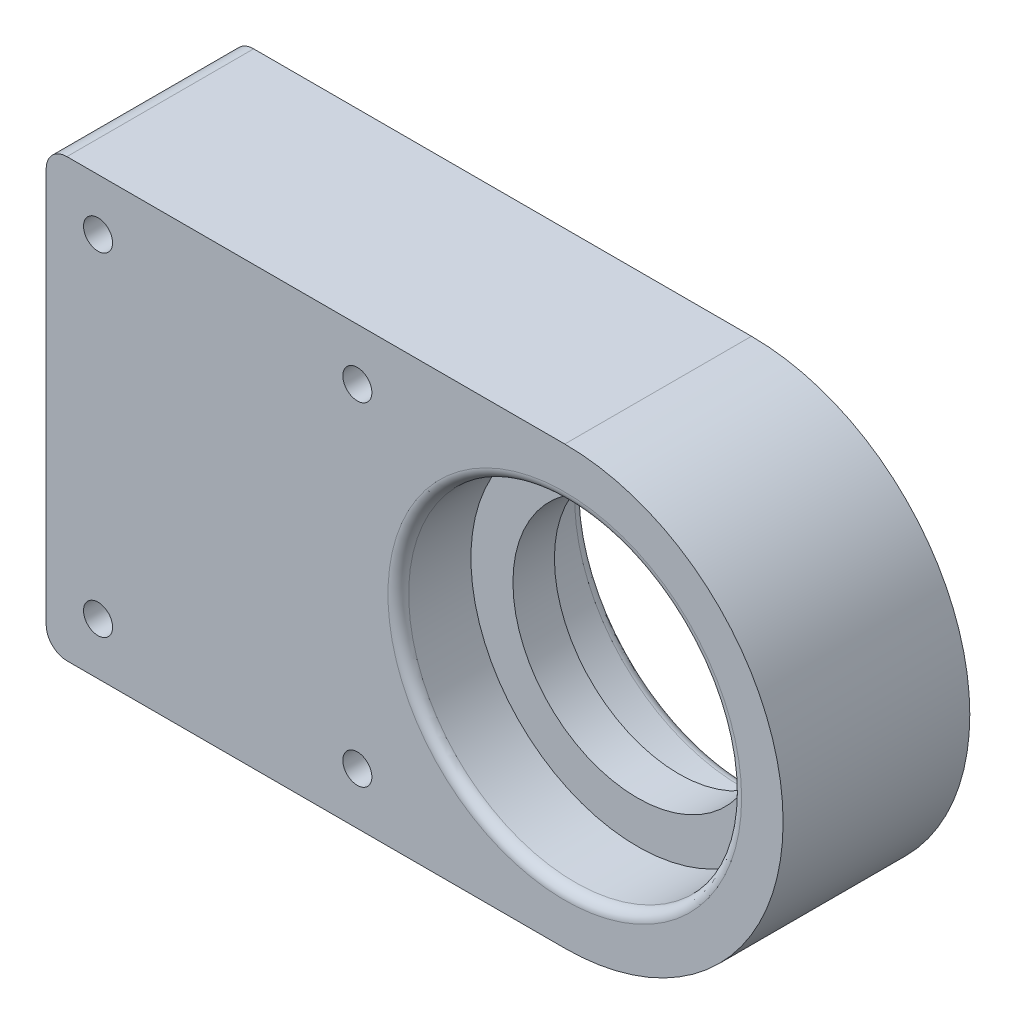
ISO-10303-21;
HEADER;
FILE_DESCRIPTION(('STEP AP214'),'2;1');
FILE_NAME('part.step','',(''),(''),'','','');
FILE_SCHEMA(('AUTOMOTIVE_DESIGN { 1 0 10303 214 1 1 1 1 }'));
ENDSEC;
DATA;
#1=APPLICATION_CONTEXT('core data for automotive mechanical design processes');
#2=APPLICATION_PROTOCOL_DEFINITION('international standard','automotive_design',2000,#1);
#3=PRODUCT_CONTEXT('',#1,'mechanical');
#4=PRODUCT('Part','Part','',(#3));
#5=PRODUCT_RELATED_PRODUCT_CATEGORY('part','',(#4));
#6=PRODUCT_DEFINITION_FORMATION('','',#4);
#7=PRODUCT_DEFINITION_CONTEXT('part definition',#1,'design');
#8=PRODUCT_DEFINITION('design','',#6,#7);
#9=PRODUCT_DEFINITION_SHAPE('','',#8);
#10=(LENGTH_UNIT() NAMED_UNIT(*) SI_UNIT(.MILLI.,.METRE.));
#11=(NAMED_UNIT(*) PLANE_ANGLE_UNIT() SI_UNIT($,.RADIAN.));
#12=(NAMED_UNIT(*) SI_UNIT($,.STERADIAN.) SOLID_ANGLE_UNIT());
#13=UNCERTAINTY_MEASURE_WITH_UNIT(LENGTH_MEASURE(1.E-05),#10,'distance_accuracy_value','');
#14=(GEOMETRIC_REPRESENTATION_CONTEXT(3) GLOBAL_UNCERTAINTY_ASSIGNED_CONTEXT((#13)) GLOBAL_UNIT_ASSIGNED_CONTEXT((#10,
#11,#12)) REPRESENTATION_CONTEXT('',''));
#15=CARTESIAN_POINT('',(0.,0.,0.));
#16=DIRECTION('',(0.,0.,1.));
#17=DIRECTION('',(1.,0.,0.));
#18=AXIS2_PLACEMENT_3D('',#15,#16,#17);
#19=CARTESIAN_POINT('',(0.,0.,-9.));
#20=DIRECTION('',(0.,0.,1.));
#21=DIRECTION('',(1.,0.,0.));
#22=AXIS2_PLACEMENT_3D('',#19,#20,#21);
#23=CYLINDRICAL_SURFACE('',#22,16.05);
#24=CARTESIAN_POINT('',(0.,0.,-8.));
#25=DIRECTION('',(0.,0.,1.));
#26=DIRECTION('',(1.,0.,0.));
#27=AXIS2_PLACEMENT_3D('',#24,#25,#26);
#28=CIRCLE('',#27,16.05);
#29=CARTESIAN_POINT('',(16.05,0.,-8.));
#30=VERTEX_POINT('',#29);
#31=EDGE_CURVE('E158',#30,#30,#28,.F.);
#32=ORIENTED_EDGE('',*,*,#31,.T.);
#33=EDGE_LOOP('',(#32));
#34=FACE_BOUND('',#33,.T.);
#35=CARTESIAN_POINT('',(0.,0.,-2.));
#36=DIRECTION('',(0.,0.,1.));
#37=DIRECTION('',(1.,0.,0.));
#38=AXIS2_PLACEMENT_3D('',#35,#36,#37);
#39=CIRCLE('',#38,16.05);
#40=CARTESIAN_POINT('',(16.05,0.,-2.));
#41=VERTEX_POINT('',#40);
#42=EDGE_CURVE('E137',#41,#41,#39,.F.);
#43=ORIENTED_EDGE('',*,*,#42,.F.);
#44=EDGE_LOOP('',(#43));
#45=FACE_BOUND('',#44,.T.);
#46=ADVANCED_FACE('F39',(#34,#45),#23,.F.);
#47=CARTESIAN_POINT('',(0.,0.,-9.));
#48=DIRECTION('',(0.,0.,1.));
#49=DIRECTION('',(1.,0.,0.));
#50=AXIS2_PLACEMENT_3D('',#47,#48,#49);
#51=CYLINDRICAL_SURFACE('',#50,21.05);
#52=CARTESIAN_POINT('',(0.,0.,9.));
#53=DIRECTION('',(0.,0.,1.));
#54=DIRECTION('',(1.,0.,0.));
#55=AXIS2_PLACEMENT_3D('',#52,#53,#54);
#56=CIRCLE('',#55,21.05);
#57=CARTESIAN_POINT('',(0.,-21.05,9.));
#58=VERTEX_POINT('',#57);
#59=CARTESIAN_POINT('',(0.,21.05,9.));
#60=VERTEX_POINT('',#59);
#61=EDGE_CURVE('E100',#58,#60,#56,.T.);
#62=ORIENTED_EDGE('',*,*,#61,.F.);
#63=DIRECTION('',(0.,0.,1.));
#64=VECTOR('',#63,1.);
#65=CARTESIAN_POINT('',(0.,-21.05,-9.));
#66=LINE('',#65,#64);
#67=CARTESIAN_POINT('',(0.,-21.05,-9.));
#68=VERTEX_POINT('',#67);
#69=EDGE_CURVE('E104',#68,#58,#66,.T.);
#70=ORIENTED_EDGE('',*,*,#69,.F.);
#71=CARTESIAN_POINT('',(0.,0.,-9.));
#72=DIRECTION('',(0.,0.,1.));
#73=DIRECTION('',(1.,0.,0.));
#74=AXIS2_PLACEMENT_3D('',#71,#72,#73);
#75=CIRCLE('',#74,21.05);
#76=CARTESIAN_POINT('',(0.,21.05,-9.));
#77=VERTEX_POINT('',#76);
#78=EDGE_CURVE('E102',#68,#77,#75,.T.);
#79=ORIENTED_EDGE('',*,*,#78,.T.);
#80=DIRECTION('',(0.,0.,1.));
#81=VECTOR('',#80,1.);
#82=CARTESIAN_POINT('',(0.,21.05,-9.));
#83=LINE('',#82,#81);
#84=EDGE_CURVE('E95',#77,#60,#83,.T.);
#85=ORIENTED_EDGE('',*,*,#84,.T.);
#86=EDGE_LOOP('',(#62,#70,#79,#85));
#87=FACE_BOUND('',#86,.T.);
#88=ADVANCED_FACE('F97',(#87),#51,.T.);
#89=CARTESIAN_POINT('',(-50.,-21.05,-9.));
#90=DIRECTION('',(0.,-1.,0.));
#91=DIRECTION('',(1.,0.,0.));
#92=AXIS2_PLACEMENT_3D('',#89,#90,#91);
#93=PLANE('',#92);
#94=DIRECTION('',(1.,0.,0.));
#95=VECTOR('',#94,1.);
#96=CARTESIAN_POINT('',(-50.,-21.05,9.));
#97=LINE('',#96,#95);
#98=CARTESIAN_POINT('',(-48.,-21.05,9.));
#99=VERTEX_POINT('',#98);
#100=EDGE_CURVE('E118',#99,#58,#97,.T.);
#101=ORIENTED_EDGE('',*,*,#100,.F.);
#102=DIRECTION('',(0.,0.,1.));
#103=VECTOR('',#102,1.);
#104=CARTESIAN_POINT('',(-48.,-21.05,-9.));
#105=LINE('',#104,#103);
#106=CARTESIAN_POINT('',(-48.,-21.05,-9.));
#107=VERTEX_POINT('',#106);
#108=EDGE_CURVE('E62',#99,#107,#105,.F.);
#109=ORIENTED_EDGE('',*,*,#108,.T.);
#110=DIRECTION('',(1.,0.,0.));
#111=VECTOR('',#110,1.);
#112=CARTESIAN_POINT('',(-50.,-21.05,-9.));
#113=LINE('',#112,#111);
#114=EDGE_CURVE('E105',#107,#68,#113,.T.);
#115=ORIENTED_EDGE('',*,*,#114,.T.);
#116=ORIENTED_EDGE('',*,*,#69,.T.);
#117=EDGE_LOOP('',(#101,#109,#115,#116));
#118=FACE_BOUND('',#117,.T.);
#119=ADVANCED_FACE('F181',(#118),#93,.T.);
#120=CARTESIAN_POINT('',(-50.,21.05,-9.));
#121=DIRECTION('',(-1.,0.,0.));
#122=DIRECTION('',(0.,0.,1.));
#123=AXIS2_PLACEMENT_3D('',#120,#121,#122);
#124=PLANE('',#123);
#125=DIRECTION('',(0.,-1.,0.));
#126=VECTOR('',#125,1.);
#127=CARTESIAN_POINT('',(-50.,21.05,-9.));
#128=LINE('',#127,#126);
#129=CARTESIAN_POINT('',(-50.,19.05,-9.));
#130=VERTEX_POINT('',#129);
#131=CARTESIAN_POINT('',(-50.,-19.05,-9.));
#132=VERTEX_POINT('',#131);
#133=EDGE_CURVE('E133',#130,#132,#128,.T.);
#134=ORIENTED_EDGE('',*,*,#133,.T.);
#135=DIRECTION('',(0.,0.,1.));
#136=VECTOR('',#135,1.);
#137=CARTESIAN_POINT('',(-50.,-19.05,-9.));
#138=LINE('',#137,#136);
#139=CARTESIAN_POINT('',(-50.,-19.05,9.));
#140=VERTEX_POINT('',#139);
#141=EDGE_CURVE('E143',#132,#140,#138,.T.);
#142=ORIENTED_EDGE('',*,*,#141,.T.);
#143=DIRECTION('',(0.,-1.,0.));
#144=VECTOR('',#143,1.);
#145=CARTESIAN_POINT('',(-50.,21.05,9.));
#146=LINE('',#145,#144);
#147=CARTESIAN_POINT('',(-50.,19.05,9.));
#148=VERTEX_POINT('',#147);
#149=EDGE_CURVE('E114',#148,#140,#146,.T.);
#150=ORIENTED_EDGE('',*,*,#149,.F.);
#151=DIRECTION('',(0.,0.,1.));
#152=VECTOR('',#151,1.);
#153=CARTESIAN_POINT('',(-50.,19.05,-9.));
#154=LINE('',#153,#152);
#155=EDGE_CURVE('E140',#148,#130,#154,.F.);
#156=ORIENTED_EDGE('',*,*,#155,.T.);
#157=EDGE_LOOP('',(#134,#142,#150,#156));
#158=FACE_BOUND('',#157,.T.);
#159=ADVANCED_FACE('F198',(#158),#124,.T.);
#160=CARTESIAN_POINT('',(0.,21.05,-9.));
#161=DIRECTION('',(0.,1.,0.));
#162=DIRECTION('',(-1.,0.,0.));
#163=AXIS2_PLACEMENT_3D('',#160,#161,#162);
#164=PLANE('',#163);
#165=DIRECTION('',(-1.,0.,0.));
#166=VECTOR('',#165,1.);
#167=CARTESIAN_POINT('',(0.,21.05,-9.));
#168=LINE('',#167,#166);
#169=CARTESIAN_POINT('',(-48.,21.05,-9.));
#170=VERTEX_POINT('',#169);
#171=EDGE_CURVE('E131',#77,#170,#168,.T.);
#172=ORIENTED_EDGE('',*,*,#171,.T.);
#173=DIRECTION('',(0.,0.,1.));
#174=VECTOR('',#173,1.);
#175=CARTESIAN_POINT('',(-48.,21.05,-9.));
#176=LINE('',#175,#174);
#177=CARTESIAN_POINT('',(-48.,21.05,9.));
#178=VERTEX_POINT('',#177);
#179=EDGE_CURVE('E112',#170,#178,#176,.T.);
#180=ORIENTED_EDGE('',*,*,#179,.T.);
#181=DIRECTION('',(-1.,0.,0.));
#182=VECTOR('',#181,1.);
#183=CARTESIAN_POINT('',(0.,21.05,9.));
#184=LINE('',#183,#182);
#185=EDGE_CURVE('E109',#60,#178,#184,.T.);
#186=ORIENTED_EDGE('',*,*,#185,.F.);
#187=ORIENTED_EDGE('',*,*,#84,.F.);
#188=EDGE_LOOP('',(#172,#180,#186,#187));
#189=FACE_BOUND('',#188,.T.);
#190=ADVANCED_FACE('F110',(#189),#164,.T.);
#191=CARTESIAN_POINT('',(0.,0.,-9.));
#192=DIRECTION('',(0.,0.,1.));
#193=DIRECTION('',(1.,0.,0.));
#194=AXIS2_PLACEMENT_3D('',#191,#192,#193);
#195=PLANE('',#194);
#196=CARTESIAN_POINT('',(0.,0.,-9.));
#197=DIRECTION('',(0.,0.,1.));
#198=DIRECTION('',(1.,0.,0.));
#199=AXIS2_PLACEMENT_3D('',#196,#197,#198);
#200=CIRCLE('',#199,17.05);
#201=CARTESIAN_POINT('',(17.05,0.,-9.));
#202=VERTEX_POINT('',#201);
#203=EDGE_CURVE('E155',#202,#202,#200,.T.);
#204=ORIENTED_EDGE('',*,*,#203,.T.);
#205=EDGE_LOOP('',(#204));
#206=FACE_BOUND('',#205,.T.);
#207=CARTESIAN_POINT('',(-45.,-16.05,-9.));
#208=DIRECTION('',(0.,0.,1.));
#209=DIRECTION('',(1.,0.,0.));
#210=AXIS2_PLACEMENT_3D('',#207,#208,#209);
#211=CIRCLE('',#210,1.4);
#212=CARTESIAN_POINT('',(-43.6,-16.05,-9.));
#213=VERTEX_POINT('',#212);
#214=EDGE_CURVE('E403',#213,#213,#211,.T.);
#215=ORIENTED_EDGE('',*,*,#214,.T.);
#216=EDGE_LOOP('',(#215));
#217=FACE_BOUND('',#216,.T.);
#218=CARTESIAN_POINT('',(-20.,-16.05,-9.));
#219=DIRECTION('',(0.,0.,1.));
#220=DIRECTION('',(1.,0.,0.));
#221=AXIS2_PLACEMENT_3D('',#218,#219,#220);
#222=CIRCLE('',#221,1.4);
#223=CARTESIAN_POINT('',(-18.6,-16.05,-9.));
#224=VERTEX_POINT('',#223);
#225=EDGE_CURVE('E409',#224,#224,#222,.T.);
#226=ORIENTED_EDGE('',*,*,#225,.T.);
#227=EDGE_LOOP('',(#226));
#228=FACE_BOUND('',#227,.T.);
#229=CARTESIAN_POINT('',(-20.,16.05,-9.));
#230=DIRECTION('',(0.,0.,1.));
#231=DIRECTION('',(1.,0.,0.));
#232=AXIS2_PLACEMENT_3D('',#229,#230,#231);
#233=CIRCLE('',#232,1.4);
#234=CARTESIAN_POINT('',(-18.6,16.05,-9.));
#235=VERTEX_POINT('',#234);
#236=EDGE_CURVE('E415',#235,#235,#233,.T.);
#237=ORIENTED_EDGE('',*,*,#236,.T.);
#238=EDGE_LOOP('',(#237));
#239=FACE_BOUND('',#238,.T.);
#240=CARTESIAN_POINT('',(-45.,16.05,-9.));
#241=DIRECTION('',(0.,0.,1.));
#242=DIRECTION('',(1.,0.,0.));
#243=AXIS2_PLACEMENT_3D('',#240,#241,#242);
#244=CIRCLE('',#243,1.4);
#245=CARTESIAN_POINT('',(-43.6,16.05,-9.));
#246=VERTEX_POINT('',#245);
#247=EDGE_CURVE('E394',#246,#246,#244,.T.);
#248=ORIENTED_EDGE('',*,*,#247,.T.);
#249=EDGE_LOOP('',(#248));
#250=FACE_BOUND('',#249,.T.);
#251=ORIENTED_EDGE('',*,*,#114,.F.);
#252=CARTESIAN_POINT('',(-48.,-19.05,-9.));
#253=DIRECTION('',(0.,0.,1.));
#254=DIRECTION('',(1.,0.,0.));
#255=AXIS2_PLACEMENT_3D('',#252,#253,#254);
#256=CIRCLE('',#255,2.);
#257=EDGE_CURVE('E152',#107,#132,#256,.F.);
#258=ORIENTED_EDGE('',*,*,#257,.T.);
#259=ORIENTED_EDGE('',*,*,#133,.F.);
#260=CARTESIAN_POINT('',(-48.,19.05,-9.));
#261=DIRECTION('',(0.,0.,1.));
#262=DIRECTION('',(1.,0.,0.));
#263=AXIS2_PLACEMENT_3D('',#260,#261,#262);
#264=CIRCLE('',#263,2.);
#265=EDGE_CURVE('E54',#130,#170,#264,.F.);
#266=ORIENTED_EDGE('',*,*,#265,.T.);
#267=ORIENTED_EDGE('',*,*,#171,.F.);
#268=ORIENTED_EDGE('',*,*,#78,.F.);
#269=EDGE_LOOP('',(#251,#258,#259,#266,#267,#268));
#270=FACE_BOUND('',#269,.T.);
#271=ADVANCED_FACE('F187',(#206,#217,#228,#239,#250,#270),#195,.F.);
#272=CARTESIAN_POINT('',(0.,0.,8.));
#273=DIRECTION('',(0.,0.,1.));
#274=DIRECTION('',(1.,0.,0.));
#275=AXIS2_PLACEMENT_3D('',#272,#273,#274);
#276=CIRCLE('',#275,16.05);
#277=CARTESIAN_POINT('',(16.05,0.,8.));
#278=VERTEX_POINT('',#277);
#279=EDGE_CURVE('E47',#278,#278,#276,.T.);
#280=ORIENTED_EDGE('',*,*,#279,.T.);
#281=EDGE_LOOP('',(#280));
#282=FACE_BOUND('',#281,.T.);
#283=CARTESIAN_POINT('',(0.,0.,2.));
#284=DIRECTION('',(0.,0.,1.));
#285=DIRECTION('',(1.,0.,0.));
#286=AXIS2_PLACEMENT_3D('',#283,#284,#285);
#287=CIRCLE('',#286,16.05);
#288=CARTESIAN_POINT('',(16.05,0.,2.));
#289=VERTEX_POINT('',#288);
#290=EDGE_CURVE('E120',#289,#289,#287,.F.);
#291=ORIENTED_EDGE('',*,*,#290,.T.);
#292=EDGE_LOOP('',(#291));
#293=FACE_BOUND('',#292,.T.);
#294=ADVANCED_FACE('F163',(#282,#293),#23,.F.);
#295=CARTESIAN_POINT('',(0.,0.,9.));
#296=DIRECTION('',(0.,0.,1.));
#297=DIRECTION('',(1.,0.,0.));
#298=AXIS2_PLACEMENT_3D('',#295,#296,#297);
#299=PLANE('',#298);
#300=CARTESIAN_POINT('',(0.,0.,9.));
#301=DIRECTION('',(0.,0.,1.));
#302=DIRECTION('',(1.,0.,0.));
#303=AXIS2_PLACEMENT_3D('',#300,#301,#302);
#304=CIRCLE('',#303,17.05);
#305=CARTESIAN_POINT('',(17.05,0.,9.));
#306=VERTEX_POINT('',#305);
#307=EDGE_CURVE('E12',#306,#306,#304,.F.);
#308=ORIENTED_EDGE('',*,*,#307,.T.);
#309=EDGE_LOOP('',(#308));
#310=FACE_BOUND('',#309,.T.);
#311=CARTESIAN_POINT('',(-45.,-16.05,9.));
#312=DIRECTION('',(0.,0.,1.));
#313=DIRECTION('',(1.,0.,0.));
#314=AXIS2_PLACEMENT_3D('',#311,#312,#313);
#315=CIRCLE('',#314,1.4);
#316=CARTESIAN_POINT('',(-43.6,-16.05,9.));
#317=VERTEX_POINT('',#316);
#318=EDGE_CURVE('E406',#317,#317,#315,.T.);
#319=ORIENTED_EDGE('',*,*,#318,.F.);
#320=EDGE_LOOP('',(#319));
#321=FACE_BOUND('',#320,.T.);
#322=CARTESIAN_POINT('',(-20.,-16.05,9.));
#323=DIRECTION('',(0.,0.,1.));
#324=DIRECTION('',(1.,0.,0.));
#325=AXIS2_PLACEMENT_3D('',#322,#323,#324);
#326=CIRCLE('',#325,1.4);
#327=CARTESIAN_POINT('',(-18.6,-16.05,9.));
#328=VERTEX_POINT('',#327);
#329=EDGE_CURVE('E412',#328,#328,#326,.T.);
#330=ORIENTED_EDGE('',*,*,#329,.F.);
#331=EDGE_LOOP('',(#330));
#332=FACE_BOUND('',#331,.T.);
#333=CARTESIAN_POINT('',(-20.,16.05,9.));
#334=DIRECTION('',(0.,0.,1.));
#335=DIRECTION('',(1.,0.,0.));
#336=AXIS2_PLACEMENT_3D('',#333,#334,#335);
#337=CIRCLE('',#336,1.4);
#338=CARTESIAN_POINT('',(-18.6,16.05,9.));
#339=VERTEX_POINT('',#338);
#340=EDGE_CURVE('E401',#339,#339,#337,.T.);
#341=ORIENTED_EDGE('',*,*,#340,.F.);
#342=EDGE_LOOP('',(#341));
#343=FACE_BOUND('',#342,.T.);
#344=CARTESIAN_POINT('',(-45.,16.05,9.));
#345=DIRECTION('',(0.,0.,1.));
#346=DIRECTION('',(1.,0.,0.));
#347=AXIS2_PLACEMENT_3D('',#344,#345,#346);
#348=CIRCLE('',#347,1.4);
#349=CARTESIAN_POINT('',(-43.6,16.05,9.));
#350=VERTEX_POINT('',#349);
#351=EDGE_CURVE('E397',#350,#350,#348,.T.);
#352=ORIENTED_EDGE('',*,*,#351,.F.);
#353=EDGE_LOOP('',(#352));
#354=FACE_BOUND('',#353,.T.);
#355=ORIENTED_EDGE('',*,*,#149,.T.);
#356=CARTESIAN_POINT('',(-48.,-19.05,9.));
#357=DIRECTION('',(0.,0.,1.));
#358=DIRECTION('',(1.,0.,0.));
#359=AXIS2_PLACEMENT_3D('',#356,#357,#358);
#360=CIRCLE('',#359,2.);
#361=EDGE_CURVE('E148',#140,#99,#360,.T.);
#362=ORIENTED_EDGE('',*,*,#361,.T.);
#363=ORIENTED_EDGE('',*,*,#100,.T.);
#364=ORIENTED_EDGE('',*,*,#61,.T.);
#365=ORIENTED_EDGE('',*,*,#185,.T.);
#366=CARTESIAN_POINT('',(-48.,19.05,9.));
#367=DIRECTION('',(0.,0.,1.));
#368=DIRECTION('',(1.,0.,0.));
#369=AXIS2_PLACEMENT_3D('',#366,#367,#368);
#370=CIRCLE('',#369,2.);
#371=EDGE_CURVE('E146',#178,#148,#370,.T.);
#372=ORIENTED_EDGE('',*,*,#371,.T.);
#373=EDGE_LOOP('',(#355,#362,#363,#364,#365,#372));
#374=FACE_BOUND('',#373,.T.);
#375=ADVANCED_FACE('F117',(#310,#321,#332,#343,#354,#374),#299,.T.);
#376=CARTESIAN_POINT('',(0.,0.,2.));
#377=DIRECTION('',(0.,0.,1.));
#378=DIRECTION('',(1.,0.,0.));
#379=AXIS2_PLACEMENT_3D('',#376,#377,#378);
#380=PLANE('',#379);
#381=CARTESIAN_POINT('',(0.,0.,2.));
#382=DIRECTION('',(0.,0.,1.));
#383=DIRECTION('',(1.,0.,0.));
#384=AXIS2_PLACEMENT_3D('',#381,#382,#383);
#385=CIRCLE('',#384,12.);
#386=CARTESIAN_POINT('',(12.,0.,2.));
#387=VERTEX_POINT('',#386);
#388=EDGE_CURVE('E123',#387,#387,#385,.F.);
#389=ORIENTED_EDGE('',*,*,#388,.T.);
#390=EDGE_LOOP('',(#389));
#391=FACE_BOUND('',#390,.T.);
#392=ORIENTED_EDGE('',*,*,#290,.F.);
#393=EDGE_LOOP('',(#392));
#394=FACE_BOUND('',#393,.T.);
#395=ADVANCED_FACE('F192',(#391,#394),#380,.T.);
#396=CARTESIAN_POINT('',(0.,0.,-2.));
#397=DIRECTION('',(0.,0.,1.));
#398=DIRECTION('',(1.,0.,0.));
#399=AXIS2_PLACEMENT_3D('',#396,#397,#398);
#400=PLANE('',#399);
#401=CARTESIAN_POINT('',(0.,0.,-2.));
#402=DIRECTION('',(0.,0.,1.));
#403=DIRECTION('',(1.,0.,0.));
#404=AXIS2_PLACEMENT_3D('',#401,#402,#403);
#405=CIRCLE('',#404,12.);
#406=CARTESIAN_POINT('',(12.,0.,-2.));
#407=VERTEX_POINT('',#406);
#408=EDGE_CURVE('E392',#407,#407,#405,.T.);
#409=ORIENTED_EDGE('',*,*,#408,.T.);
#410=EDGE_LOOP('',(#409));
#411=FACE_BOUND('',#410,.T.);
#412=ORIENTED_EDGE('',*,*,#42,.T.);
#413=EDGE_LOOP('',(#412));
#414=FACE_BOUND('',#413,.T.);
#415=ADVANCED_FACE('F295',(#411,#414),#400,.F.);
#416=CARTESIAN_POINT('',(0.,0.,91.5863941578757));
#417=DIRECTION('',(0.,0.,-1.));
#418=DIRECTION('',(-1.,0.,0.));
#419=AXIS2_PLACEMENT_3D('',#416,#417,#418);
#420=CYLINDRICAL_SURFACE('',#419,12.);
#421=ORIENTED_EDGE('',*,*,#388,.F.);
#422=EDGE_LOOP('',(#421));
#423=FACE_BOUND('',#422,.T.);
#424=ORIENTED_EDGE('',*,*,#408,.F.);
#425=EDGE_LOOP('',(#424));
#426=FACE_BOUND('',#425,.T.);
#427=ADVANCED_FACE('F285',(#423,#426),#420,.F.);
#428=CARTESIAN_POINT('',(-45.,16.05,-9.));
#429=DIRECTION('',(0.,0.,1.));
#430=DIRECTION('',(1.,0.,0.));
#431=AXIS2_PLACEMENT_3D('',#428,#429,#430);
#432=CYLINDRICAL_SURFACE('',#431,1.4);
#433=ORIENTED_EDGE('',*,*,#247,.F.);
#434=EDGE_LOOP('',(#433));
#435=FACE_BOUND('',#434,.T.);
#436=ORIENTED_EDGE('',*,*,#351,.T.);
#437=EDGE_LOOP('',(#436));
#438=FACE_BOUND('',#437,.T.);
#439=ADVANCED_FACE('F275',(#435,#438),#432,.F.);
#440=CARTESIAN_POINT('',(-20.,16.05,-9.));
#441=DIRECTION('',(0.,0.,1.));
#442=DIRECTION('',(1.,0.,0.));
#443=AXIS2_PLACEMENT_3D('',#440,#441,#442);
#444=CYLINDRICAL_SURFACE('',#443,1.4);
#445=ORIENTED_EDGE('',*,*,#236,.F.);
#446=EDGE_LOOP('',(#445));
#447=FACE_BOUND('',#446,.T.);
#448=ORIENTED_EDGE('',*,*,#340,.T.);
#449=EDGE_LOOP('',(#448));
#450=FACE_BOUND('',#449,.T.);
#451=ADVANCED_FACE('F265',(#447,#450),#444,.F.);
#452=CARTESIAN_POINT('',(-20.,-16.05,-9.));
#453=DIRECTION('',(0.,0.,1.));
#454=DIRECTION('',(1.,0.,0.));
#455=AXIS2_PLACEMENT_3D('',#452,#453,#454);
#456=CYLINDRICAL_SURFACE('',#455,1.4);
#457=ORIENTED_EDGE('',*,*,#225,.F.);
#458=EDGE_LOOP('',(#457));
#459=FACE_BOUND('',#458,.T.);
#460=ORIENTED_EDGE('',*,*,#329,.T.);
#461=EDGE_LOOP('',(#460));
#462=FACE_BOUND('',#461,.T.);
#463=ADVANCED_FACE('F255',(#459,#462),#456,.F.);
#464=CARTESIAN_POINT('',(-45.,-16.05,-9.));
#465=DIRECTION('',(0.,0.,1.));
#466=DIRECTION('',(1.,0.,0.));
#467=AXIS2_PLACEMENT_3D('',#464,#465,#466);
#468=CYLINDRICAL_SURFACE('',#467,1.4);
#469=ORIENTED_EDGE('',*,*,#214,.F.);
#470=EDGE_LOOP('',(#469));
#471=FACE_BOUND('',#470,.T.);
#472=ORIENTED_EDGE('',*,*,#318,.T.);
#473=EDGE_LOOP('',(#472));
#474=FACE_BOUND('',#473,.T.);
#475=ADVANCED_FACE('F210',(#471,#474),#468,.F.);
#476=CARTESIAN_POINT('',(-48.,-19.05,-9.));
#477=DIRECTION('',(0.,0.,1.));
#478=DIRECTION('',(1.,0.,0.));
#479=AXIS2_PLACEMENT_3D('',#476,#477,#478);
#480=CYLINDRICAL_SURFACE('',#479,2.);
#481=ORIENTED_EDGE('',*,*,#257,.F.);
#482=ORIENTED_EDGE('',*,*,#108,.F.);
#483=ORIENTED_EDGE('',*,*,#361,.F.);
#484=ORIENTED_EDGE('',*,*,#141,.F.);
#485=EDGE_LOOP('',(#481,#482,#483,#484));
#486=FACE_BOUND('',#485,.T.);
#487=ADVANCED_FACE('F207',(#486),#480,.T.);
#488=CARTESIAN_POINT('',(-48.,19.05,-9.));
#489=DIRECTION('',(0.,0.,1.));
#490=DIRECTION('',(1.,0.,0.));
#491=AXIS2_PLACEMENT_3D('',#488,#489,#490);
#492=CYLINDRICAL_SURFACE('',#491,2.);
#493=ORIENTED_EDGE('',*,*,#265,.F.);
#494=ORIENTED_EDGE('',*,*,#155,.F.);
#495=ORIENTED_EDGE('',*,*,#371,.F.);
#496=ORIENTED_EDGE('',*,*,#179,.F.);
#497=EDGE_LOOP('',(#493,#494,#495,#496));
#498=FACE_BOUND('',#497,.T.);
#499=ADVANCED_FACE('F172',(#498),#492,.T.);
#500=CARTESIAN_POINT('',(0.,0.,-8.));
#501=DIRECTION('',(0.,0.,1.));
#502=DIRECTION('',(1.,0.,0.));
#503=AXIS2_PLACEMENT_3D('',#500,#501,#502);
#504=TOROIDAL_SURFACE('',#503,17.05,1.);
#505=ORIENTED_EDGE('',*,*,#31,.F.);
#506=EDGE_LOOP('',(#505));
#507=FACE_BOUND('',#506,.T.);
#508=ORIENTED_EDGE('',*,*,#203,.F.);
#509=EDGE_LOOP('',(#508));
#510=FACE_BOUND('',#509,.T.);
#511=ADVANCED_FACE('F167',(#507,#510),#504,.T.);
#512=CARTESIAN_POINT('',(0.,0.,8.));
#513=DIRECTION('',(0.,0.,1.));
#514=DIRECTION('',(1.,0.,0.));
#515=AXIS2_PLACEMENT_3D('',#512,#513,#514);
#516=TOROIDAL_SURFACE('',#515,17.05,1.);
#517=ORIENTED_EDGE('',*,*,#307,.F.);
#518=EDGE_LOOP('',(#517));
#519=FACE_BOUND('',#518,.T.);
#520=ORIENTED_EDGE('',*,*,#279,.F.);
#521=EDGE_LOOP('',(#520));
#522=FACE_BOUND('',#521,.T.);
#523=ADVANCED_FACE('F41',(#519,#522),#516,.T.);
#524=CLOSED_SHELL('',(#46,#88,#119,#159,#190,#271,#294,#375,#395,#415,#427,#439,#451,#463,#475,
#487,#499,#511,#523));
#525=MANIFOLD_SOLID_BREP('B2',#524);
#526=ADVANCED_BREP_SHAPE_REPRESENTATION('',(#18,#525),#14);
#527=SHAPE_DEFINITION_REPRESENTATION(#9,#526);
ENDSEC;
END-ISO-10303-21;
